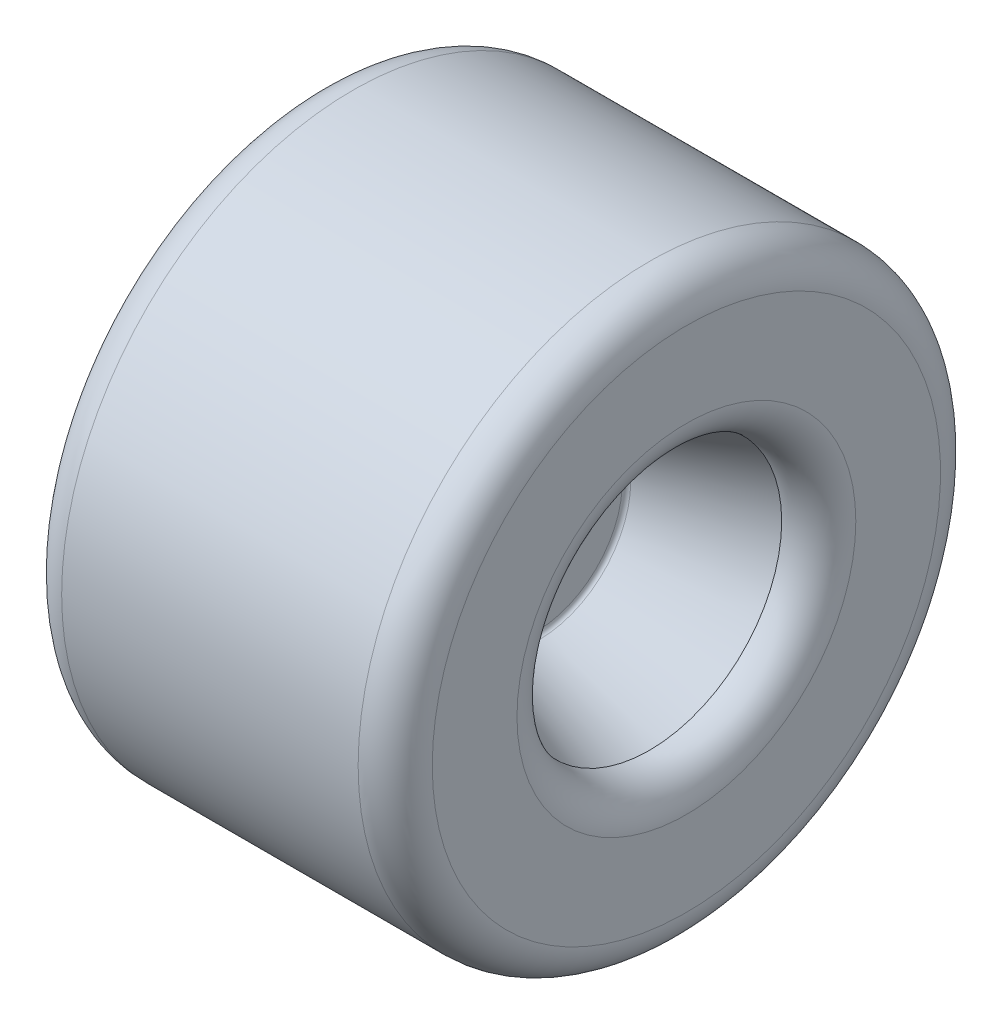
ISO-10303-21;
HEADER;
FILE_DESCRIPTION(('STEP AP214'),'2;1');
FILE_NAME('part.step','',(''),(''),'','','');
FILE_SCHEMA(('AUTOMOTIVE_DESIGN { 1 0 10303 214 1 1 1 1 }'));
ENDSEC;
DATA;
#1=APPLICATION_CONTEXT('core data for automotive mechanical design processes');
#2=APPLICATION_PROTOCOL_DEFINITION('international standard','automotive_design',2000,#1);
#3=PRODUCT_CONTEXT('',#1,'mechanical');
#4=PRODUCT('Part','Part','',(#3));
#5=PRODUCT_RELATED_PRODUCT_CATEGORY('part','',(#4));
#6=PRODUCT_DEFINITION_FORMATION('','',#4);
#7=PRODUCT_DEFINITION_CONTEXT('part definition',#1,'design');
#8=PRODUCT_DEFINITION('design','',#6,#7);
#9=PRODUCT_DEFINITION_SHAPE('','',#8);
#10=(LENGTH_UNIT() NAMED_UNIT(*) SI_UNIT(.MILLI.,.METRE.));
#11=(NAMED_UNIT(*) PLANE_ANGLE_UNIT() SI_UNIT($,.RADIAN.));
#12=(NAMED_UNIT(*) SI_UNIT($,.STERADIAN.) SOLID_ANGLE_UNIT());
#13=UNCERTAINTY_MEASURE_WITH_UNIT(LENGTH_MEASURE(1.E-05),#10,'distance_accuracy_value','');
#14=(GEOMETRIC_REPRESENTATION_CONTEXT(3) GLOBAL_UNCERTAINTY_ASSIGNED_CONTEXT((#13)) GLOBAL_UNIT_ASSIGNED_CONTEXT((#10,
#11,#12)) REPRESENTATION_CONTEXT('',''));
#15=CARTESIAN_POINT('',(0.,0.,0.));
#16=DIRECTION('',(0.,0.,1.));
#17=DIRECTION('',(1.,0.,0.));
#18=AXIS2_PLACEMENT_3D('',#15,#16,#17);
#19=CARTESIAN_POINT('',(16.51,0.,0.));
#20=DIRECTION('',(-1.,0.,0.));
#21=DIRECTION('',(0.,0.,1.));
#22=AXIS2_PLACEMENT_3D('',#19,#20,#21);
#23=PLANE('',#22);
#24=CARTESIAN_POINT('',(16.51,0.,0.));
#25=DIRECTION('',(-1.,0.,0.));
#26=DIRECTION('',(0.,0.,1.));
#27=AXIS2_PLACEMENT_3D('',#24,#25,#26);
#28=CIRCLE('',#27,41.6536215106937);
#29=CARTESIAN_POINT('',(16.51,0.,41.6536215106937));
#30=VERTEX_POINT('',#29);
#31=EDGE_CURVE('E43',#30,#30,#28,.F.);
#32=ORIENTED_EDGE('',*,*,#31,.T.);
#33=EDGE_LOOP('',(#32));
#34=FACE_BOUND('',#33,.T.);
#35=CARTESIAN_POINT('',(16.51,0.,-31.75));
#36=DIRECTION('',(-1.,0.,0.));
#37=DIRECTION('',(0.,0.,1.));
#38=AXIS2_PLACEMENT_3D('',#35,#36,#37);
#39=CIRCLE('',#38,5.);
#40=CARTESIAN_POINT('',(16.51,0.,-26.75));
#41=VERTEX_POINT('',#40);
#42=EDGE_CURVE('E56',#41,#41,#39,.T.);
#43=ORIENTED_EDGE('',*,*,#42,.T.);
#44=EDGE_LOOP('',(#43));
#45=FACE_BOUND('',#44,.T.);
#46=CARTESIAN_POINT('',(16.51,-27.4963065701559,15.8750000000001));
#47=DIRECTION('',(-1.,0.,0.));
#48=DIRECTION('',(0.,0.,1.));
#49=AXIS2_PLACEMENT_3D('',#46,#47,#48);
#50=CIRCLE('',#49,5.);
#51=CARTESIAN_POINT('',(16.51,-27.4963065701559,20.8750000000001));
#52=VERTEX_POINT('',#51);
#53=EDGE_CURVE('E57',#52,#52,#50,.T.);
#54=ORIENTED_EDGE('',*,*,#53,.T.);
#55=EDGE_LOOP('',(#54));
#56=FACE_BOUND('',#55,.T.);
#57=CARTESIAN_POINT('',(16.51,27.4963065701561,15.8749999999997));
#58=DIRECTION('',(-1.,0.,0.));
#59=DIRECTION('',(0.,0.,1.));
#60=AXIS2_PLACEMENT_3D('',#57,#58,#59);
#61=CIRCLE('',#60,5.);
#62=CARTESIAN_POINT('',(16.51,27.4963065701561,20.8749999999997));
#63=VERTEX_POINT('',#62);
#64=EDGE_CURVE('E61',#63,#63,#61,.T.);
#65=ORIENTED_EDGE('',*,*,#64,.T.);
#66=EDGE_LOOP('',(#65));
#67=FACE_BOUND('',#66,.T.);
#68=CARTESIAN_POINT('',(16.51,0.,0.));
#69=DIRECTION('',(-1.,0.,0.));
#70=DIRECTION('',(0.,0.,1.));
#71=AXIS2_PLACEMENT_3D('',#68,#69,#70);
#72=CIRCLE('',#71,21.59);
#73=CARTESIAN_POINT('',(16.51,0.,21.59));
#74=VERTEX_POINT('',#73);
#75=EDGE_CURVE('E68',#74,#74,#72,.T.);
#76=ORIENTED_EDGE('',*,*,#75,.T.);
#77=EDGE_LOOP('',(#76));
#78=FACE_BOUND('',#77,.T.);
#79=ADVANCED_FACE('F32',(#34,#45,#56,#67,#78),#23,.F.);
#80=CARTESIAN_POINT('',(16.51,0.,0.));
#81=DIRECTION('',(1.,0.,0.));
#82=DIRECTION('',(0.,0.,-1.));
#83=AXIS2_PLACEMENT_3D('',#80,#81,#82);
#84=CONICAL_SURFACE('',#83,43.4261192183775,0.352255085455071);
#85=CARTESIAN_POINT('',(18.1736611392346,0.,0.));
#86=DIRECTION('',(1.,0.,0.));
#87=DIRECTION('',(0.,0.,-1.));
#88=AXIS2_PLACEMENT_3D('',#85,#86,#87);
#89=CIRCLE('',#88,44.0376580458819);
#90=CARTESIAN_POINT('',(18.1736611392346,0.,-44.0376580458819));
#91=VERTEX_POINT('',#90);
#92=EDGE_CURVE('E47',#91,#91,#89,.F.);
#93=ORIENTED_EDGE('',*,*,#92,.T.);
#94=EDGE_LOOP('',(#93));
#95=FACE_BOUND('',#94,.T.);
#96=CARTESIAN_POINT('',(71.12,0.,0.));
#97=DIRECTION('',(-1.,0.,0.));
#98=DIRECTION('',(0.,0.,1.));
#99=AXIS2_PLACEMENT_3D('',#96,#97,#98);
#100=CIRCLE('',#99,63.5);
#101=CARTESIAN_POINT('',(71.12,0.,63.5));
#102=VERTEX_POINT('',#101);
#103=EDGE_CURVE('E52',#102,#102,#100,.T.);
#104=ORIENTED_EDGE('',*,*,#103,.F.);
#105=EDGE_LOOP('',(#104));
#106=FACE_BOUND('',#105,.T.);
#107=ADVANCED_FACE('F121',(#95,#106),#84,.F.);
#108=CARTESIAN_POINT('',(71.12,0.,0.));
#109=DIRECTION('',(-1.,0.,0.));
#110=DIRECTION('',(0.,0.,1.));
#111=AXIS2_PLACEMENT_3D('',#108,#109,#110);
#112=TOROIDAL_SURFACE('',#111,81.28,17.78);
#113=CARTESIAN_POINT('',(88.9,0.,0.));
#114=DIRECTION('',(-1.,0.,0.));
#115=DIRECTION('',(0.,0.,1.));
#116=AXIS2_PLACEMENT_3D('',#113,#114,#115);
#117=CIRCLE('',#116,81.28);
#118=CARTESIAN_POINT('',(88.9,0.,81.28));
#119=VERTEX_POINT('',#118);
#120=EDGE_CURVE('E71',#119,#119,#117,.T.);
#121=ORIENTED_EDGE('',*,*,#120,.F.);
#122=EDGE_LOOP('',(#121));
#123=FACE_BOUND('',#122,.T.);
#124=ORIENTED_EDGE('',*,*,#103,.T.);
#125=EDGE_LOOP('',(#124));
#126=FACE_BOUND('',#125,.T.);
#127=ADVANCED_FACE('F127',(#123,#126),#112,.T.);
#128=CARTESIAN_POINT('',(88.9,121.92,0.));
#129=DIRECTION('',(-1.,0.,0.));
#130=DIRECTION('',(0.,0.,1.));
#131=AXIS2_PLACEMENT_3D('',#128,#129,#130);
#132=PLANE('',#131);
#133=CARTESIAN_POINT('',(88.9,0.,0.));
#134=DIRECTION('',(-1.,0.,0.));
#135=DIRECTION('',(0.,0.,1.));
#136=AXIS2_PLACEMENT_3D('',#133,#134,#135);
#137=CIRCLE('',#136,121.92);
#138=CARTESIAN_POINT('',(88.9,0.,121.92));
#139=VERTEX_POINT('',#138);
#140=EDGE_CURVE('E74',#139,#139,#137,.T.);
#141=ORIENTED_EDGE('',*,*,#140,.F.);
#142=EDGE_LOOP('',(#141));
#143=FACE_BOUND('',#142,.T.);
#144=ORIENTED_EDGE('',*,*,#120,.T.);
#145=EDGE_LOOP('',(#144));
#146=FACE_BOUND('',#145,.T.);
#147=ADVANCED_FACE('F149',(#143,#146),#132,.F.);
#148=CARTESIAN_POINT('',(71.12,0.,0.));
#149=DIRECTION('',(-1.,0.,0.));
#150=DIRECTION('',(0.,0.,1.));
#151=AXIS2_PLACEMENT_3D('',#148,#149,#150);
#152=TOROIDAL_SURFACE('',#151,121.92,17.78);
#153=CARTESIAN_POINT('',(71.12,0.,0.));
#154=DIRECTION('',(-1.,0.,0.));
#155=DIRECTION('',(0.,0.,1.));
#156=AXIS2_PLACEMENT_3D('',#153,#154,#155);
#157=CIRCLE('',#156,139.7);
#158=CARTESIAN_POINT('',(71.12,0.,139.7));
#159=VERTEX_POINT('',#158);
#160=EDGE_CURVE('E77',#159,#159,#157,.T.);
#161=ORIENTED_EDGE('',*,*,#160,.F.);
#162=EDGE_LOOP('',(#161));
#163=FACE_BOUND('',#162,.T.);
#164=ORIENTED_EDGE('',*,*,#140,.T.);
#165=EDGE_LOOP('',(#164));
#166=FACE_BOUND('',#165,.T.);
#167=ADVANCED_FACE('F154',(#163,#166),#152,.T.);
#168=CARTESIAN_POINT('',(3.79674298209649,0.,0.));
#169=DIRECTION('',(-1.,0.,0.));
#170=DIRECTION('',(0.,0.,1.));
#171=AXIS2_PLACEMENT_3D('',#168,#169,#170);
#172=CYLINDRICAL_SURFACE('',#171,139.7);
#173=CARTESIAN_POINT('',(-71.12,0.,0.));
#174=DIRECTION('',(-1.,0.,0.));
#175=DIRECTION('',(0.,0.,1.));
#176=AXIS2_PLACEMENT_3D('',#173,#174,#175);
#177=CIRCLE('',#176,139.7);
#178=CARTESIAN_POINT('',(-71.12,0.,139.7));
#179=VERTEX_POINT('',#178);
#180=EDGE_CURVE('E80',#179,#179,#177,.T.);
#181=ORIENTED_EDGE('',*,*,#180,.F.);
#182=EDGE_LOOP('',(#181));
#183=FACE_BOUND('',#182,.T.);
#184=ORIENTED_EDGE('',*,*,#160,.T.);
#185=EDGE_LOOP('',(#184));
#186=FACE_BOUND('',#185,.T.);
#187=ADVANCED_FACE('F161',(#183,#186),#172,.T.);
#188=CARTESIAN_POINT('',(-71.12,0.,0.));
#189=DIRECTION('',(-1.,0.,0.));
#190=DIRECTION('',(0.,0.,1.));
#191=AXIS2_PLACEMENT_3D('',#188,#189,#190);
#192=TOROIDAL_SURFACE('',#191,121.92,17.78);
#193=CARTESIAN_POINT('',(-88.9,0.,0.));
#194=DIRECTION('',(-1.,0.,0.));
#195=DIRECTION('',(0.,0.,1.));
#196=AXIS2_PLACEMENT_3D('',#193,#194,#195);
#197=CIRCLE('',#196,121.92);
#198=CARTESIAN_POINT('',(-88.9,0.,121.92));
#199=VERTEX_POINT('',#198);
#200=EDGE_CURVE('E83',#199,#199,#197,.T.);
#201=ORIENTED_EDGE('',*,*,#200,.F.);
#202=EDGE_LOOP('',(#201));
#203=FACE_BOUND('',#202,.T.);
#204=ORIENTED_EDGE('',*,*,#180,.T.);
#205=EDGE_LOOP('',(#204));
#206=FACE_BOUND('',#205,.T.);
#207=ADVANCED_FACE('F165',(#203,#206),#192,.T.);
#208=CARTESIAN_POINT('',(-88.9,121.92,0.));
#209=DIRECTION('',(1.,0.,0.));
#210=DIRECTION('',(0.,0.,-1.));
#211=AXIS2_PLACEMENT_3D('',#208,#209,#210);
#212=PLANE('',#211);
#213=CARTESIAN_POINT('',(-88.9,0.,0.));
#214=DIRECTION('',(-1.,0.,0.));
#215=DIRECTION('',(0.,0.,1.));
#216=AXIS2_PLACEMENT_3D('',#213,#214,#215);
#217=CIRCLE('',#216,81.28);
#218=CARTESIAN_POINT('',(-88.9,0.,81.28));
#219=VERTEX_POINT('',#218);
#220=EDGE_CURVE('E86',#219,#219,#217,.T.);
#221=ORIENTED_EDGE('',*,*,#220,.F.);
#222=EDGE_LOOP('',(#221));
#223=FACE_BOUND('',#222,.T.);
#224=ORIENTED_EDGE('',*,*,#200,.T.);
#225=EDGE_LOOP('',(#224));
#226=FACE_BOUND('',#225,.T.);
#227=ADVANCED_FACE('F169',(#223,#226),#212,.F.);
#228=CARTESIAN_POINT('',(-71.12,0.,0.));
#229=DIRECTION('',(-1.,0.,0.));
#230=DIRECTION('',(0.,0.,1.));
#231=AXIS2_PLACEMENT_3D('',#228,#229,#230);
#232=TOROIDAL_SURFACE('',#231,81.28,17.78);
#233=CARTESIAN_POINT('',(-71.12,0.,0.));
#234=DIRECTION('',(-1.,0.,0.));
#235=DIRECTION('',(0.,0.,1.));
#236=AXIS2_PLACEMENT_3D('',#233,#234,#235);
#237=CIRCLE('',#236,63.5);
#238=CARTESIAN_POINT('',(-71.12,0.,63.5));
#239=VERTEX_POINT('',#238);
#240=EDGE_CURVE('E89',#239,#239,#237,.T.);
#241=ORIENTED_EDGE('',*,*,#240,.F.);
#242=EDGE_LOOP('',(#241));
#243=FACE_BOUND('',#242,.T.);
#244=ORIENTED_EDGE('',*,*,#220,.T.);
#245=EDGE_LOOP('',(#244));
#246=FACE_BOUND('',#245,.T.);
#247=ADVANCED_FACE('F173',(#243,#246),#232,.T.);
#248=CARTESIAN_POINT('',(-71.12,0.,0.));
#249=DIRECTION('',(-1.,0.,0.));
#250=DIRECTION('',(0.,0.,1.));
#251=AXIS2_PLACEMENT_3D('',#248,#249,#250);
#252=CONICAL_SURFACE('',#251,63.5,0.261799387799146);
#253=CARTESIAN_POINT('',(1.91414335665689,0.,0.));
#254=DIRECTION('',(-1.,0.,0.));
#255=DIRECTION('',(0.,0.,1.));
#256=AXIS2_PLACEMENT_3D('',#253,#254,#255);
#257=CIRCLE('',#256,43.9305602676852);
#258=CARTESIAN_POINT('',(1.91414335665689,0.,43.9305602676852));
#259=VERTEX_POINT('',#258);
#260=EDGE_CURVE('E10',#259,#259,#257,.F.);
#261=ORIENTED_EDGE('',*,*,#260,.T.);
#262=EDGE_LOOP('',(#261));
#263=FACE_BOUND('',#262,.T.);
#264=ORIENTED_EDGE('',*,*,#240,.T.);
#265=EDGE_LOOP('',(#264));
#266=FACE_BOUND('',#265,.T.);
#267=ADVANCED_FACE('F177',(#263,#266),#252,.F.);
#268=CARTESIAN_POINT('',(3.79674298209649,43.4261192183775,0.));
#269=DIRECTION('',(1.,0.,0.));
#270=DIRECTION('',(0.,0.,-1.));
#271=AXIS2_PLACEMENT_3D('',#268,#269,#270);
#272=PLANE('',#271);
#273=CARTESIAN_POINT('',(3.79674298209649,0.,0.));
#274=DIRECTION('',(1.,0.,0.));
#275=DIRECTION('',(0.,0.,-1.));
#276=AXIS2_PLACEMENT_3D('',#273,#274,#275);
#277=CIRCLE('',#276,41.477108668911);
#278=CARTESIAN_POINT('',(3.79674298209649,0.,-41.477108668911));
#279=VERTEX_POINT('',#278);
#280=EDGE_CURVE('E39',#279,#279,#277,.F.);
#281=ORIENTED_EDGE('',*,*,#280,.T.);
#282=EDGE_LOOP('',(#281));
#283=FACE_BOUND('',#282,.T.);
#284=CARTESIAN_POINT('',(3.79674298209649,0.,-31.75));
#285=DIRECTION('',(1.,0.,0.));
#286=DIRECTION('',(0.,0.,-1.));
#287=AXIS2_PLACEMENT_3D('',#284,#285,#286);
#288=CIRCLE('',#287,5.);
#289=CARTESIAN_POINT('',(3.79674298209649,0.,-36.75));
#290=VERTEX_POINT('',#289);
#291=EDGE_CURVE('E53',#290,#290,#288,.T.);
#292=ORIENTED_EDGE('',*,*,#291,.T.);
#293=EDGE_LOOP('',(#292));
#294=FACE_BOUND('',#293,.T.);
#295=CARTESIAN_POINT('',(3.79674298209649,-27.4963065701559,15.8750000000001));
#296=DIRECTION('',(1.,0.,0.));
#297=DIRECTION('',(0.,0.,-1.));
#298=AXIS2_PLACEMENT_3D('',#295,#296,#297);
#299=CIRCLE('',#298,5.);
#300=CARTESIAN_POINT('',(3.79674298209649,-27.4963065701559,10.8750000000001));
#301=VERTEX_POINT('',#300);
#302=EDGE_CURVE('E58',#301,#301,#299,.T.);
#303=ORIENTED_EDGE('',*,*,#302,.T.);
#304=EDGE_LOOP('',(#303));
#305=FACE_BOUND('',#304,.T.);
#306=CARTESIAN_POINT('',(3.79674298209649,27.4963065701561,15.8749999999997));
#307=DIRECTION('',(1.,0.,0.));
#308=DIRECTION('',(0.,0.,-1.));
#309=AXIS2_PLACEMENT_3D('',#306,#307,#308);
#310=CIRCLE('',#309,5.);
#311=CARTESIAN_POINT('',(3.79674298209649,27.4963065701561,10.8749999999997));
#312=VERTEX_POINT('',#311);
#313=EDGE_CURVE('E62',#312,#312,#310,.T.);
#314=ORIENTED_EDGE('',*,*,#313,.T.);
#315=EDGE_LOOP('',(#314));
#316=FACE_BOUND('',#315,.T.);
#317=CARTESIAN_POINT('',(3.79674298209649,0.,0.));
#318=DIRECTION('',(1.,0.,0.));
#319=DIRECTION('',(0.,0.,-1.));
#320=AXIS2_PLACEMENT_3D('',#317,#318,#319);
#321=CIRCLE('',#320,21.59);
#322=CARTESIAN_POINT('',(3.79674298209649,0.,-21.59));
#323=VERTEX_POINT('',#322);
#324=EDGE_CURVE('E65',#323,#323,#321,.T.);
#325=ORIENTED_EDGE('',*,*,#324,.T.);
#326=EDGE_LOOP('',(#325));
#327=FACE_BOUND('',#326,.T.);
#328=ADVANCED_FACE('F116',(#283,#294,#305,#316,#327),#272,.F.);
#329=CARTESIAN_POINT('',(-88.9,0.,0.));
#330=DIRECTION('',(1.,0.,0.));
#331=DIRECTION('',(0.,0.,-1.));
#332=AXIS2_PLACEMENT_3D('',#329,#330,#331);
#333=CYLINDRICAL_SURFACE('',#332,21.59);
#334=ORIENTED_EDGE('',*,*,#324,.F.);
#335=EDGE_LOOP('',(#334));
#336=FACE_BOUND('',#335,.T.);
#337=ORIENTED_EDGE('',*,*,#75,.F.);
#338=EDGE_LOOP('',(#337));
#339=FACE_BOUND('',#338,.T.);
#340=ADVANCED_FACE('F106',(#336,#339),#333,.F.);
#341=CARTESIAN_POINT('',(-88.9,27.4963065701561,15.8749999999997));
#342=DIRECTION('',(1.,0.,0.));
#343=DIRECTION('',(0.,0.,-1.));
#344=AXIS2_PLACEMENT_3D('',#341,#342,#343);
#345=CYLINDRICAL_SURFACE('',#344,5.);
#346=ORIENTED_EDGE('',*,*,#313,.F.);
#347=EDGE_LOOP('',(#346));
#348=FACE_BOUND('',#347,.T.);
#349=ORIENTED_EDGE('',*,*,#64,.F.);
#350=EDGE_LOOP('',(#349));
#351=FACE_BOUND('',#350,.T.);
#352=ADVANCED_FACE('F103',(#348,#351),#345,.F.);
#353=CARTESIAN_POINT('',(-88.9,-27.4963065701559,15.8750000000001));
#354=DIRECTION('',(1.,0.,0.));
#355=DIRECTION('',(0.,0.,-1.));
#356=AXIS2_PLACEMENT_3D('',#353,#354,#355);
#357=CYLINDRICAL_SURFACE('',#356,5.);
#358=ORIENTED_EDGE('',*,*,#302,.F.);
#359=EDGE_LOOP('',(#358));
#360=FACE_BOUND('',#359,.T.);
#361=ORIENTED_EDGE('',*,*,#53,.F.);
#362=EDGE_LOOP('',(#361));
#363=FACE_BOUND('',#362,.T.);
#364=ADVANCED_FACE('F105',(#360,#363),#357,.F.);
#365=CARTESIAN_POINT('',(-88.9,0.,-31.75));
#366=DIRECTION('',(1.,0.,0.));
#367=DIRECTION('',(0.,0.,-1.));
#368=AXIS2_PLACEMENT_3D('',#365,#366,#367);
#369=CYLINDRICAL_SURFACE('',#368,5.);
#370=ORIENTED_EDGE('',*,*,#291,.F.);
#371=EDGE_LOOP('',(#370));
#372=FACE_BOUND('',#371,.T.);
#373=ORIENTED_EDGE('',*,*,#42,.F.);
#374=EDGE_LOOP('',(#373));
#375=FACE_BOUND('',#374,.T.);
#376=ADVANCED_FACE('F113',(#372,#375),#369,.F.);
#377=CARTESIAN_POINT('',(19.05,0.,0.));
#378=DIRECTION('',(-1.,0.,0.));
#379=DIRECTION('',(0.,0.,1.));
#380=AXIS2_PLACEMENT_3D('',#377,#378,#379);
#381=TOROIDAL_SURFACE('',#380,41.6536215106937,2.54);
#382=ORIENTED_EDGE('',*,*,#31,.F.);
#383=EDGE_LOOP('',(#382));
#384=FACE_BOUND('',#383,.T.);
#385=ORIENTED_EDGE('',*,*,#92,.F.);
#386=EDGE_LOOP('',(#385));
#387=FACE_BOUND('',#386,.T.);
#388=ADVANCED_FACE('F132',(#384,#387),#381,.F.);
#389=CARTESIAN_POINT('',(1.25674298209649,0.,0.));
#390=DIRECTION('',(1.,0.,0.));
#391=DIRECTION('',(0.,0.,-1.));
#392=AXIS2_PLACEMENT_3D('',#389,#390,#391);
#393=TOROIDAL_SURFACE('',#392,41.477108668911,2.54);
#394=ORIENTED_EDGE('',*,*,#260,.F.);
#395=EDGE_LOOP('',(#394));
#396=FACE_BOUND('',#395,.T.);
#397=ORIENTED_EDGE('',*,*,#280,.F.);
#398=EDGE_LOOP('',(#397));
#399=FACE_BOUND('',#398,.T.);
#400=ADVANCED_FACE('F34',(#396,#399),#393,.F.);
#401=CLOSED_SHELL('',(#79,#107,#127,#147,#167,#187,#207,#227,#247,#267,#328,#340,#352,#364,#376,
#388,#400));
#402=MANIFOLD_SOLID_BREP('B2',#401);
#403=ADVANCED_BREP_SHAPE_REPRESENTATION('',(#18,#402),#14);
#404=SHAPE_DEFINITION_REPRESENTATION(#9,#403);
ENDSEC;
END-ISO-10303-21;
